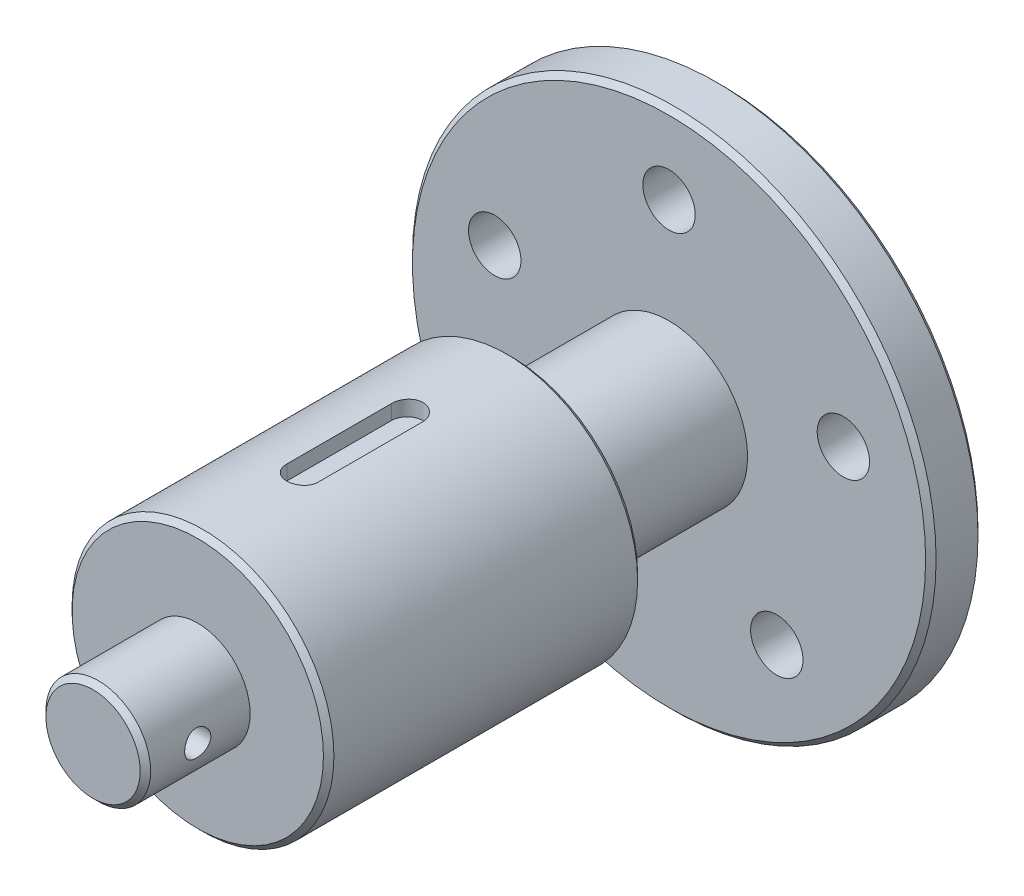
ISO-10303-21;
HEADER;
FILE_DESCRIPTION(('STEP AP214'),'2;1');
FILE_NAME('part.step','',(''),(''),'','','');
FILE_SCHEMA(('AUTOMOTIVE_DESIGN { 1 0 10303 214 1 1 1 1 }'));
ENDSEC;
DATA;
#1=APPLICATION_CONTEXT('core data for automotive mechanical design processes');
#2=APPLICATION_PROTOCOL_DEFINITION('international standard','automotive_design',2000,#1);
#3=PRODUCT_CONTEXT('',#1,'mechanical');
#4=PRODUCT('Part','Part','',(#3));
#5=PRODUCT_RELATED_PRODUCT_CATEGORY('part','',(#4));
#6=PRODUCT_DEFINITION_FORMATION('','',#4);
#7=PRODUCT_DEFINITION_CONTEXT('part definition',#1,'design');
#8=PRODUCT_DEFINITION('design','',#6,#7);
#9=PRODUCT_DEFINITION_SHAPE('','',#8);
#10=(LENGTH_UNIT() NAMED_UNIT(*) SI_UNIT(.MILLI.,.METRE.));
#11=(NAMED_UNIT(*) PLANE_ANGLE_UNIT() SI_UNIT($,.RADIAN.));
#12=(NAMED_UNIT(*) SI_UNIT($,.STERADIAN.) SOLID_ANGLE_UNIT());
#13=UNCERTAINTY_MEASURE_WITH_UNIT(LENGTH_MEASURE(1.E-05),#10,'distance_accuracy_value','');
#14=(GEOMETRIC_REPRESENTATION_CONTEXT(3) GLOBAL_UNCERTAINTY_ASSIGNED_CONTEXT((#13)) GLOBAL_UNIT_ASSIGNED_CONTEXT((#10,
#11,#12)) REPRESENTATION_CONTEXT('',''));
#15=CARTESIAN_POINT('',(0.,0.,0.));
#16=DIRECTION('',(0.,0.,1.));
#17=DIRECTION('',(1.,0.,0.));
#18=AXIS2_PLACEMENT_3D('',#15,#16,#17);
#19=CARTESIAN_POINT('',(0.,0.,0.));
#20=DIRECTION('',(0.,0.,1.));
#21=DIRECTION('',(1.,0.,0.));
#22=AXIS2_PLACEMENT_3D('',#19,#20,#21);
#23=PLANE('',#22);
#24=CARTESIAN_POINT('',(0.,35.,0.));
#25=DIRECTION('',(0.,0.,-1.));
#26=DIRECTION('',(-1.,0.,0.));
#27=AXIS2_PLACEMENT_3D('',#24,#25,#26);
#28=CIRCLE('',#27,4.99999999999999);
#29=CARTESIAN_POINT('',(-4.99999999999999,35.,0.));
#30=VERTEX_POINT('',#29);
#31=EDGE_CURVE('E106',#30,#30,#28,.T.);
#32=ORIENTED_EDGE('',*,*,#31,.F.);
#33=EDGE_LOOP('',(#32));
#34=FACE_BOUND('',#33,.T.);
#35=CARTESIAN_POINT('',(33.28697807033,10.8155948031243,0.));
#36=DIRECTION('',(0.,0.,-1.));
#37=DIRECTION('',(-1.,0.,0.));
#38=AXIS2_PLACEMENT_3D('',#35,#36,#37);
#39=CIRCLE('',#38,4.99999999999999);
#40=CARTESIAN_POINT('',(28.28697807033,10.8155948031243,0.));
#41=VERTEX_POINT('',#40);
#42=EDGE_CURVE('E115',#41,#41,#39,.T.);
#43=ORIENTED_EDGE('',*,*,#42,.F.);
#44=EDGE_LOOP('',(#43));
#45=FACE_BOUND('',#44,.T.);
#46=CARTESIAN_POINT('',(20.5724838302385,-28.3155948031218,0.));
#47=DIRECTION('',(0.,0.,-1.));
#48=DIRECTION('',(-1.,0.,0.));
#49=AXIS2_PLACEMENT_3D('',#46,#47,#48);
#50=CIRCLE('',#49,4.99999999999999);
#51=CARTESIAN_POINT('',(15.5724838302385,-28.3155948031218,0.));
#52=VERTEX_POINT('',#51);
#53=EDGE_CURVE('E121',#52,#52,#50,.T.);
#54=ORIENTED_EDGE('',*,*,#53,.F.);
#55=EDGE_LOOP('',(#54));
#56=FACE_BOUND('',#55,.T.);
#57=CARTESIAN_POINT('',(-20.5724838302337,-28.3155948031252,0.));
#58=DIRECTION('',(0.,0.,-1.));
#59=DIRECTION('',(-1.,0.,0.));
#60=AXIS2_PLACEMENT_3D('',#57,#58,#59);
#61=CIRCLE('',#60,4.99999999999999);
#62=CARTESIAN_POINT('',(-25.5724838302337,-28.3155948031252,0.));
#63=VERTEX_POINT('',#62);
#64=EDGE_CURVE('E127',#63,#63,#61,.T.);
#65=ORIENTED_EDGE('',*,*,#64,.F.);
#66=EDGE_LOOP('',(#65));
#67=FACE_BOUND('',#66,.T.);
#68=CARTESIAN_POINT('',(0.,0.,0.));
#69=DIRECTION('',(0.,0.,1.));
#70=DIRECTION('',(1.,0.,0.));
#71=AXIS2_PLACEMENT_3D('',#68,#69,#70);
#72=CIRCLE('',#71,49.);
#73=CARTESIAN_POINT('',(49.,0.,0.));
#74=VERTEX_POINT('',#73);
#75=EDGE_CURVE('E176',#74,#74,#72,.F.);
#76=ORIENTED_EDGE('',*,*,#75,.T.);
#77=EDGE_LOOP('',(#76));
#78=FACE_BOUND('',#77,.T.);
#79=CARTESIAN_POINT('',(-33.2869780703318,10.8155948031187,0.));
#80=DIRECTION('',(0.,0.,-1.));
#81=DIRECTION('',(-1.,0.,0.));
#82=AXIS2_PLACEMENT_3D('',#79,#80,#81);
#83=CIRCLE('',#82,4.99999999999999);
#84=CARTESIAN_POINT('',(-38.2869780703318,10.8155948031187,0.));
#85=VERTEX_POINT('',#84);
#86=EDGE_CURVE('E133',#85,#85,#83,.T.);
#87=ORIENTED_EDGE('',*,*,#86,.F.);
#88=EDGE_LOOP('',(#87));
#89=FACE_BOUND('',#88,.T.);
#90=ADVANCED_FACE('F33',(#34,#45,#56,#67,#78,#89),#23,.F.);
#91=CARTESIAN_POINT('',(0.,0.,10.));
#92=DIRECTION('',(0.,0.,-1.));
#93=DIRECTION('',(-1.,0.,0.));
#94=AXIS2_PLACEMENT_3D('',#91,#92,#93);
#95=CYLINDRICAL_SURFACE('',#94,50.);
#96=CARTESIAN_POINT('',(0.,0.,8.99999999999994));
#97=DIRECTION('',(0.,0.,1.));
#98=DIRECTION('',(1.,0.,0.));
#99=AXIS2_PLACEMENT_3D('',#96,#97,#98);
#100=CIRCLE('',#99,50.);
#101=CARTESIAN_POINT('',(50.,0.,8.99999999999994));
#102=VERTEX_POINT('',#101);
#103=EDGE_CURVE('E173',#102,#102,#100,.F.);
#104=ORIENTED_EDGE('',*,*,#103,.T.);
#105=EDGE_LOOP('',(#104));
#106=FACE_BOUND('',#105,.T.);
#107=CARTESIAN_POINT('',(0.,0.,1.00000000000001));
#108=DIRECTION('',(0.,0.,1.));
#109=DIRECTION('',(1.,0.,0.));
#110=AXIS2_PLACEMENT_3D('',#107,#108,#109);
#111=CIRCLE('',#110,50.);
#112=CARTESIAN_POINT('',(50.,0.,1.00000000000001));
#113=VERTEX_POINT('',#112);
#114=EDGE_CURVE('E170',#113,#113,#111,.T.);
#115=ORIENTED_EDGE('',*,*,#114,.T.);
#116=EDGE_LOOP('',(#115));
#117=FACE_BOUND('',#116,.T.);
#118=ADVANCED_FACE('F255',(#106,#117),#95,.T.);
#119=CARTESIAN_POINT('',(0.,0.,10.));
#120=DIRECTION('',(0.,0.,1.));
#121=DIRECTION('',(1.,0.,0.));
#122=AXIS2_PLACEMENT_3D('',#119,#120,#121);
#123=PLANE('',#122);
#124=CARTESIAN_POINT('',(0.,35.,10.));
#125=DIRECTION('',(0.,0.,1.));
#126=DIRECTION('',(1.,0.,0.));
#127=AXIS2_PLACEMENT_3D('',#124,#125,#126);
#128=CIRCLE('',#127,4.99999999999999);
#129=CARTESIAN_POINT('',(4.99999999999999,35.,10.));
#130=VERTEX_POINT('',#129);
#131=EDGE_CURVE('E112',#130,#130,#128,.T.);
#132=ORIENTED_EDGE('',*,*,#131,.F.);
#133=EDGE_LOOP('',(#132));
#134=FACE_BOUND('',#133,.T.);
#135=CARTESIAN_POINT('',(33.28697807033,10.8155948031243,10.));
#136=DIRECTION('',(0.,0.,1.));
#137=DIRECTION('',(1.,0.,0.));
#138=AXIS2_PLACEMENT_3D('',#135,#136,#137);
#139=CIRCLE('',#138,4.99999999999999);
#140=CARTESIAN_POINT('',(38.28697807033,10.8155948031243,10.));
#141=VERTEX_POINT('',#140);
#142=EDGE_CURVE('E118',#141,#141,#139,.T.);
#143=ORIENTED_EDGE('',*,*,#142,.F.);
#144=EDGE_LOOP('',(#143));
#145=FACE_BOUND('',#144,.T.);
#146=CARTESIAN_POINT('',(20.5724838302385,-28.3155948031218,10.));
#147=DIRECTION('',(0.,0.,1.));
#148=DIRECTION('',(1.,0.,0.));
#149=AXIS2_PLACEMENT_3D('',#146,#147,#148);
#150=CIRCLE('',#149,4.99999999999999);
#151=CARTESIAN_POINT('',(25.5724838302385,-28.3155948031218,10.));
#152=VERTEX_POINT('',#151);
#153=EDGE_CURVE('E124',#152,#152,#150,.T.);
#154=ORIENTED_EDGE('',*,*,#153,.F.);
#155=EDGE_LOOP('',(#154));
#156=FACE_BOUND('',#155,.T.);
#157=CARTESIAN_POINT('',(-20.5724838302337,-28.3155948031252,10.));
#158=DIRECTION('',(0.,0.,1.));
#159=DIRECTION('',(1.,0.,0.));
#160=AXIS2_PLACEMENT_3D('',#157,#158,#159);
#161=CIRCLE('',#160,4.99999999999999);
#162=CARTESIAN_POINT('',(-15.5724838302337,-28.3155948031252,10.));
#163=VERTEX_POINT('',#162);
#164=EDGE_CURVE('E130',#163,#163,#161,.T.);
#165=ORIENTED_EDGE('',*,*,#164,.F.);
#166=EDGE_LOOP('',(#165));
#167=FACE_BOUND('',#166,.T.);
#168=CARTESIAN_POINT('',(-33.2869780703318,10.8155948031187,10.));
#169=DIRECTION('',(0.,0.,1.));
#170=DIRECTION('',(1.,0.,0.));
#171=AXIS2_PLACEMENT_3D('',#168,#169,#170);
#172=CIRCLE('',#171,4.99999999999999);
#173=CARTESIAN_POINT('',(-28.2869780703318,10.8155948031187,10.));
#174=VERTEX_POINT('',#173);
#175=EDGE_CURVE('E136',#174,#174,#172,.T.);
#176=ORIENTED_EDGE('',*,*,#175,.F.);
#177=EDGE_LOOP('',(#176));
#178=FACE_BOUND('',#177,.T.);
#179=CARTESIAN_POINT('',(0.,0.,10.));
#180=DIRECTION('',(0.,0.,1.));
#181=DIRECTION('',(1.,0.,0.));
#182=AXIS2_PLACEMENT_3D('',#179,#180,#181);
#183=CIRCLE('',#182,48.9999999999999);
#184=CARTESIAN_POINT('',(48.9999999999999,0.,10.));
#185=VERTEX_POINT('',#184);
#186=EDGE_CURVE('E167',#185,#185,#183,.T.);
#187=ORIENTED_EDGE('',*,*,#186,.T.);
#188=EDGE_LOOP('',(#187));
#189=FACE_BOUND('',#188,.T.);
#190=CARTESIAN_POINT('',(0.,0.,10.));
#191=DIRECTION('',(0.,0.,1.));
#192=DIRECTION('',(1.,0.,0.));
#193=AXIS2_PLACEMENT_3D('',#190,#191,#192);
#194=CIRCLE('',#193,15.);
#195=CARTESIAN_POINT('',(15.,0.,10.));
#196=VERTEX_POINT('',#195);
#197=EDGE_CURVE('E146',#196,#196,#194,.T.);
#198=ORIENTED_EDGE('',*,*,#197,.F.);
#199=EDGE_LOOP('',(#198));
#200=FACE_BOUND('',#199,.T.);
#201=ADVANCED_FACE('F261',(#134,#145,#156,#167,#178,#189,#200),#123,.T.);
#202=CARTESIAN_POINT('',(0.,0.,38.));
#203=DIRECTION('',(0.,0.,-1.));
#204=DIRECTION('',(-1.,0.,0.));
#205=AXIS2_PLACEMENT_3D('',#202,#203,#204);
#206=CYLINDRICAL_SURFACE('',#205,15.);
#207=ORIENTED_EDGE('',*,*,#197,.T.);
#208=EDGE_LOOP('',(#207));
#209=FACE_BOUND('',#208,.T.);
#210=CARTESIAN_POINT('',(0.,0.,39.));
#211=DIRECTION('',(0.,0.,1.));
#212=DIRECTION('',(1.,0.,0.));
#213=AXIS2_PLACEMENT_3D('',#210,#211,#212);
#214=CIRCLE('',#213,15.);
#215=CARTESIAN_POINT('',(15.,0.,39.));
#216=VERTEX_POINT('',#215);
#217=EDGE_CURVE('E142',#216,#216,#214,.T.);
#218=ORIENTED_EDGE('',*,*,#217,.F.);
#219=EDGE_LOOP('',(#218));
#220=FACE_BOUND('',#219,.T.);
#221=ADVANCED_FACE('F298',(#209,#220),#206,.T.);
#222=CARTESIAN_POINT('',(0.,0.,40.));
#223=DIRECTION('',(0.,0.,1.));
#224=DIRECTION('',(1.,0.,0.));
#225=AXIS2_PLACEMENT_3D('',#222,#223,#224);
#226=CONICAL_SURFACE('',#225,16.,0.78539816339745);
#227=CARTESIAN_POINT('',(0.,0.,40.));
#228=DIRECTION('',(0.,0.,1.));
#229=DIRECTION('',(1.,0.,0.));
#230=AXIS2_PLACEMENT_3D('',#227,#228,#229);
#231=CIRCLE('',#230,16.);
#232=CARTESIAN_POINT('',(16.,0.,40.));
#233=VERTEX_POINT('',#232);
#234=EDGE_CURVE('E143',#233,#233,#231,.T.);
#235=ORIENTED_EDGE('',*,*,#234,.F.);
#236=EDGE_LOOP('',(#235));
#237=FACE_BOUND('',#236,.T.);
#238=ORIENTED_EDGE('',*,*,#217,.T.);
#239=EDGE_LOOP('',(#238));
#240=FACE_BOUND('',#239,.T.);
#241=ADVANCED_FACE('F35',(#237,#240),#226,.T.);
#242=CARTESIAN_POINT('',(0.,0.,100.));
#243=DIRECTION('',(0.,0.,-1.));
#244=DIRECTION('',(-1.,0.,0.));
#245=AXIS2_PLACEMENT_3D('',#242,#243,#244);
#246=CYLINDRICAL_SURFACE('',#245,25.);
#247=DIRECTION('',(0.,0.,-1.));
#248=VECTOR('',#247,1.);
#249=CARTESIAN_POINT('',(3.,24.8193472919817,100.));
#250=LINE('',#249,#248);
#251=CARTESIAN_POINT('',(3.,24.8193472919817,60.));
#252=VERTEX_POINT('',#251);
#253=CARTESIAN_POINT('',(3.,24.8193472919817,80.));
#254=VERTEX_POINT('',#253);
#255=EDGE_CURVE('E45',#252,#254,#250,.F.);
#256=ORIENTED_EDGE('',*,*,#255,.T.);
#257=CARTESIAN_POINT('',(3.,24.8193472919817,80.));
#258=CARTESIAN_POINT('',(3.00000843700235,24.8193430736193,80.0840545705342));
#259=CARTESIAN_POINT('',(2.99646747025333,24.8197741982077,80.1681048931886));
#260=CARTESIAN_POINT('',(2.98235207723993,24.8214759555701,80.3355982142583));
#261=CARTESIAN_POINT('',(2.97177817640363,24.8227465256294,80.4190412575723));
#262=CARTESIAN_POINT('',(2.94367627524766,24.8260943334576,80.5846512438442));
#263=CARTESIAN_POINT('',(2.92615522582029,24.8281707648871,80.6668193772675));
#264=CARTESIAN_POINT('',(2.88430583660214,24.833067059444,80.8293564953975));
#265=CARTESIAN_POINT('',(2.85997754065988,24.8358869177826,80.9097254916898));
#266=CARTESIAN_POINT('',(2.77699495332482,24.8453506394644,81.1473385626879));
#267=CARTESIAN_POINT('',(2.70832727734934,24.8530006371154,81.3011805834116));
#268=CARTESIAN_POINT('',(2.54636529375022,24.8701147720304,81.5950593886498));
#269=CARTESIAN_POINT('',(2.45307313505292,24.8795787509723,81.7350973763492));
#270=CARTESIAN_POINT('',(2.24397860633709,24.8993093935248,81.9982262561697));
#271=CARTESIAN_POINT('',(2.12807646891959,24.9095794895088,82.1212377475461));
#272=CARTESIAN_POINT('',(1.87725939084289,24.929735159082,82.3461199338231));
#273=CARTESIAN_POINT('',(1.74234155834833,24.9396206738931,82.447987407384));
#274=CARTESIAN_POINT('',(1.45682542703622,24.9579276686417,82.6279687423429));
#275=CARTESIAN_POINT('',(1.30618100217361,24.9663446368759,82.7060099362334));
#276=CARTESIAN_POINT('',(0.993816096927468,24.9807274830984,82.8356516687918));
#277=CARTESIAN_POINT('',(0.832096656054217,24.9866935907597,82.8872546851235));
#278=CARTESIAN_POINT('',(0.502989868574016,24.995478678279,82.9623217642843));
#279=CARTESIAN_POINT('',(0.335633549841869,24.9983126679218,82.9859200722378));
#280=CARTESIAN_POINT('',(-0.000690387403202205,25.0005654502745,83.0047237227123));
#281=CARTESIAN_POINT('',(-0.169657986279599,24.9999842845517,82.9999294108113));
#282=CARTESIAN_POINT('',(-0.503486116101073,24.9954842865412,82.9621908286483));
#283=CARTESIAN_POINT('',(-0.668363323052679,24.9915826671991,82.929391729926));
#284=CARTESIAN_POINT('',(-0.990255211381976,24.9808996061534,82.8368015166855));
#285=CARTESIAN_POINT('',(-1.14726979527835,24.9741181287549,82.7770100676064));
#286=CARTESIAN_POINT('',(-1.44943435784417,24.9584076216555,82.6319757638004));
#287=CARTESIAN_POINT('',(-1.59455350752095,24.9494732343632,82.5466692842213));
#288=CARTESIAN_POINT('',(-1.86846446131942,24.930457665413,82.353076275243));
#289=CARTESIAN_POINT('',(-1.99725627311207,24.9203764842939,82.2447897566404));
#290=CARTESIAN_POINT('',(-2.23569948521557,24.9001221731951,82.0075139289929));
#291=CARTESIAN_POINT('',(-2.34522783687393,24.8899488597477,81.8784009599752));
#292=CARTESIAN_POINT('',(-2.54111038184353,24.8707153122042,81.6035092642862));
#293=CARTESIAN_POINT('',(-2.62745765364829,24.8616554109923,81.4577255784871));
#294=CARTESIAN_POINT('',(-2.77453048342125,24.8456732661311,81.1535048272786));
#295=CARTESIAN_POINT('',(-2.83523138851723,24.8387530810146,80.9950557602794));
#296=CARTESIAN_POINT('',(-2.92904058504843,24.8278671834514,80.6702276497036));
#297=CARTESIAN_POINT('',(-2.96219046692828,24.8238970186796,80.5038609613066));
#298=CARTESIAN_POINT('',(-2.98741264811551,24.8208658563087,80.2802534901679));
#299=CARTESIAN_POINT('',(-2.9921351676027,24.8202967895628,80.2242586935252));
#300=CARTESIAN_POINT('',(-2.9984246127832,24.8195379557837,80.1121838100649));
#301=CARTESIAN_POINT('',(-2.99999682241004,24.8193475536301,80.0561040242145));
#302=CARTESIAN_POINT('',(-3.,24.8193472919817,80.));
#303=B_SPLINE_CURVE_WITH_KNOTS('',3,(#257,#258,#259,#260,#261,#262,#263,#264,#265,#266,#267,
#268,#269,#270,#271,#272,#273,#274,#275,#276,#277,#278,#279,#280,#281,#282,#283,#284,#285,#286,
#287,#288,#289,#290,#291,#292,#293,#294,#295,#296,#297,#298,#299,#300,#301,#302),.UNSPECIFIED.,
.F.,.F.,(4,2,2,2,2,2,2,2,2,2,2,2,2,2,2,2,2,2,2,2,2,2,4),(0.,0.252080487248506,0.504142143765632,
0.755952236629464,1.00776070750916,1.51110152671864,2.01439843495776,2.51996855511054,
3.02561564359015,3.53278983870557,4.03991649509848,4.54460220919589,5.04928178057385,
5.55136096184882,6.0534463663943,6.55679437122678,7.0601421395737,7.56659676194981,
8.07320243596131,8.5802939887554,9.08661864921346,9.25514284244893,9.42338413699563),.UNSPECIFIED.);
#304=CARTESIAN_POINT('',(-3.,24.8193472919817,80.));
#305=VERTEX_POINT('',#304);
#306=EDGE_CURVE('E179',#254,#305,#303,.T.);
#307=ORIENTED_EDGE('',*,*,#306,.T.);
#308=DIRECTION('',(0.,0.,-1.));
#309=VECTOR('',#308,1.);
#310=CARTESIAN_POINT('',(-3.,24.8193472919817,100.));
#311=LINE('',#310,#309);
#312=CARTESIAN_POINT('',(-3.,24.8193472919817,60.));
#313=VERTEX_POINT('',#312);
#314=EDGE_CURVE('E479',#305,#313,#311,.T.);
#315=ORIENTED_EDGE('',*,*,#314,.T.);
#316=CARTESIAN_POINT('',(-3.,24.8193472919817,60.));
#317=CARTESIAN_POINT('',(-3.00000843700235,24.8193430736193,59.9159454294658));
#318=CARTESIAN_POINT('',(-2.99646747025333,24.8197741982077,59.8318951068114));
#319=CARTESIAN_POINT('',(-2.98235207723993,24.8214759555701,59.6644017857418));
#320=CARTESIAN_POINT('',(-2.97177817640363,24.8227465256294,59.5809587424277));
#321=CARTESIAN_POINT('',(-2.94367627524767,24.8260943334576,59.4153487561558));
#322=CARTESIAN_POINT('',(-2.92615522582029,24.8281707648871,59.3331806227325));
#323=CARTESIAN_POINT('',(-2.88430583660214,24.833067059444,59.1706435046025));
#324=CARTESIAN_POINT('',(-2.85997754065988,24.8358869177826,59.0902745083102));
#325=CARTESIAN_POINT('',(-2.77699495332482,24.8453506394644,58.8526614373121));
#326=CARTESIAN_POINT('',(-2.70832727734934,24.8530006371154,58.6988194165884));
#327=CARTESIAN_POINT('',(-2.54636529375022,24.8701147720304,58.4049406113502));
#328=CARTESIAN_POINT('',(-2.45307313505291,24.8795787509723,58.2649026236509));
#329=CARTESIAN_POINT('',(-2.24397860633709,24.8993093935248,58.0017737438303));
#330=CARTESIAN_POINT('',(-2.12807646891959,24.9095794895088,57.8787622524539));
#331=CARTESIAN_POINT('',(-1.87725939084289,24.929735159082,57.6538800661769));
#332=CARTESIAN_POINT('',(-1.74234155834833,24.9396206738931,57.552012592616));
#333=CARTESIAN_POINT('',(-1.45682542703621,24.9579276686417,57.3720312576571));
#334=CARTESIAN_POINT('',(-1.30618100217361,24.9663446368759,57.2939900637666));
#335=CARTESIAN_POINT('',(-0.99381609692747,24.9807274830984,57.1643483312083));
#336=CARTESIAN_POINT('',(-0.832096656054217,24.9866935907597,57.1127453148765));
#337=CARTESIAN_POINT('',(-0.502989868574015,24.995478678279,57.0376782357158));
#338=CARTESIAN_POINT('',(-0.335633549841869,24.9983126679218,57.0140799277623));
#339=CARTESIAN_POINT('',(0.000690387403201825,25.0005654502745,56.9952762772877));
#340=CARTESIAN_POINT('',(0.169657986279598,24.9999842845517,57.0000705891887));
#341=CARTESIAN_POINT('',(0.503486116101072,24.9954842865412,57.0378091713518));
#342=CARTESIAN_POINT('',(0.668363323052679,24.9915826671991,57.070608270074));
#343=CARTESIAN_POINT('',(0.990255211381976,24.9808996061534,57.1631984833145));
#344=CARTESIAN_POINT('',(1.14726979527834,24.9741181287549,57.2229899323936));
#345=CARTESIAN_POINT('',(1.44943435784416,24.9584076216555,57.3680242361996));
#346=CARTESIAN_POINT('',(1.59455350752095,24.9494732343632,57.4533307157787));
#347=CARTESIAN_POINT('',(1.86846446131942,24.930457665413,57.646923724757));
#348=CARTESIAN_POINT('',(1.99725627311207,24.9203764842939,57.7552102433596));
#349=CARTESIAN_POINT('',(2.23569948521557,24.9001221731951,57.9924860710071));
#350=CARTESIAN_POINT('',(2.34522783687393,24.8899488597477,58.1215990400248));
#351=CARTESIAN_POINT('',(2.54111038184352,24.8707153122042,58.3964907357138));
#352=CARTESIAN_POINT('',(2.62745765364829,24.8616554109923,58.5422744215129));
#353=CARTESIAN_POINT('',(2.77453048342125,24.8456732661311,58.8464951727214));
#354=CARTESIAN_POINT('',(2.83523138851723,24.8387530810146,59.0049442397206));
#355=CARTESIAN_POINT('',(2.92904058504843,24.8278671834514,59.3297723502964));
#356=CARTESIAN_POINT('',(2.96219046692828,24.8238970186796,59.4961390386934));
#357=CARTESIAN_POINT('',(2.98741264811551,24.8208658563087,59.7197465098321));
#358=CARTESIAN_POINT('',(2.99213516760269,24.8202967895628,59.7757413064748));
#359=CARTESIAN_POINT('',(2.99842461278319,24.8195379557837,59.8878161899351));
#360=CARTESIAN_POINT('',(2.99999682241004,24.8193475536301,59.9438959757855));
#361=CARTESIAN_POINT('',(3.,24.8193472919817,60.));
#362=B_SPLINE_CURVE_WITH_KNOTS('',3,(#316,#317,#318,#319,#320,#321,#322,#323,#324,#325,#326,
#327,#328,#329,#330,#331,#332,#333,#334,#335,#336,#337,#338,#339,#340,#341,#342,#343,#344,#345,
#346,#347,#348,#349,#350,#351,#352,#353,#354,#355,#356,#357,#358,#359,#360,#361),.UNSPECIFIED.,
.F.,.F.,(4,2,2,2,2,2,2,2,2,2,2,2,2,2,2,2,2,2,2,2,2,2,4),(0.,0.252080487248506,0.504142143765639,
0.755952236629471,1.00776070750916,1.51110152671864,2.01439843495776,2.51996855511055,
3.02561564359015,3.53278983870558,4.03991649509848,4.54460220919589,5.04928178057385,
5.55136096184882,6.05344636639431,6.55679437122678,7.0601421395737,7.56659676194982,
8.07320243596131,8.5802939887554,9.08661864921346,9.25514284244891,9.42338413699562),.UNSPECIFIED.);
#363=EDGE_CURVE('E52',#313,#252,#362,.T.);
#364=ORIENTED_EDGE('',*,*,#363,.T.);
#365=EDGE_LOOP('',(#256,#307,#315,#364));
#366=FACE_BOUND('',#365,.T.);
#367=CARTESIAN_POINT('',(0.,0.,99.));
#368=DIRECTION('',(0.,0.,1.));
#369=DIRECTION('',(1.,0.,0.));
#370=AXIS2_PLACEMENT_3D('',#367,#368,#369);
#371=CIRCLE('',#370,25.);
#372=CARTESIAN_POINT('',(25.,0.,99.));
#373=VERTEX_POINT('',#372);
#374=EDGE_CURVE('E161',#373,#373,#371,.F.);
#375=ORIENTED_EDGE('',*,*,#374,.T.);
#376=EDGE_LOOP('',(#375));
#377=FACE_BOUND('',#376,.T.);
#378=CARTESIAN_POINT('',(0.,0.,41.));
#379=DIRECTION('',(0.,0.,1.));
#380=DIRECTION('',(1.,0.,0.));
#381=AXIS2_PLACEMENT_3D('',#378,#379,#380);
#382=CIRCLE('',#381,25.);
#383=CARTESIAN_POINT('',(25.,0.,41.));
#384=VERTEX_POINT('',#383);
#385=EDGE_CURVE('E158',#384,#384,#382,.T.);
#386=ORIENTED_EDGE('',*,*,#385,.T.);
#387=EDGE_LOOP('',(#386));
#388=FACE_BOUND('',#387,.T.);
#389=ADVANCED_FACE('F194',(#366,#377,#388),#246,.T.);
#390=CARTESIAN_POINT('',(0.,0.,100.));
#391=DIRECTION('',(0.,0.,1.));
#392=DIRECTION('',(1.,0.,0.));
#393=AXIS2_PLACEMENT_3D('',#390,#391,#392);
#394=PLANE('',#393);
#395=CARTESIAN_POINT('',(0.,0.,100.));
#396=DIRECTION('',(0.,0.,1.));
#397=DIRECTION('',(1.,0.,0.));
#398=AXIS2_PLACEMENT_3D('',#395,#396,#397);
#399=CIRCLE('',#398,24.);
#400=CARTESIAN_POINT('',(24.,0.,100.));
#401=VERTEX_POINT('',#400);
#402=EDGE_CURVE('E155',#401,#401,#399,.T.);
#403=ORIENTED_EDGE('',*,*,#402,.T.);
#404=EDGE_LOOP('',(#403));
#405=FACE_BOUND('',#404,.T.);
#406=CARTESIAN_POINT('',(0.,0.,100.));
#407=DIRECTION('',(0.,0.,1.));
#408=DIRECTION('',(1.,0.,0.));
#409=AXIS2_PLACEMENT_3D('',#406,#407,#408);
#410=CIRCLE('',#409,10.);
#411=CARTESIAN_POINT('',(10.,0.,100.));
#412=VERTEX_POINT('',#411);
#413=EDGE_CURVE('E139',#412,#412,#410,.T.);
#414=ORIENTED_EDGE('',*,*,#413,.F.);
#415=EDGE_LOOP('',(#414));
#416=FACE_BOUND('',#415,.T.);
#417=ADVANCED_FACE('F241',(#405,#416),#394,.T.);
#418=CARTESIAN_POINT('',(0.,0.,40.));
#419=DIRECTION('',(0.,0.,1.));
#420=DIRECTION('',(1.,0.,0.));
#421=AXIS2_PLACEMENT_3D('',#418,#419,#420);
#422=PLANE('',#421);
#423=CARTESIAN_POINT('',(0.,0.,40.));
#424=DIRECTION('',(0.,0.,1.));
#425=DIRECTION('',(1.,0.,0.));
#426=AXIS2_PLACEMENT_3D('',#423,#424,#425);
#427=CIRCLE('',#426,24.);
#428=CARTESIAN_POINT('',(24.,0.,40.));
#429=VERTEX_POINT('',#428);
#430=EDGE_CURVE('E164',#429,#429,#427,.F.);
#431=ORIENTED_EDGE('',*,*,#430,.T.);
#432=EDGE_LOOP('',(#431));
#433=FACE_BOUND('',#432,.T.);
#434=ORIENTED_EDGE('',*,*,#234,.T.);
#435=EDGE_LOOP('',(#434));
#436=FACE_BOUND('',#435,.T.);
#437=ADVANCED_FACE('F239',(#433,#436),#422,.F.);
#438=CARTESIAN_POINT('',(0.,0.,120.));
#439=DIRECTION('',(0.,0.,-1.));
#440=DIRECTION('',(-1.,0.,0.));
#441=AXIS2_PLACEMENT_3D('',#438,#439,#440);
#442=CYLINDRICAL_SURFACE('',#441,10.);
#443=CARTESIAN_POINT('',(-10.,0.,112.5));
#444=CARTESIAN_POINT('',(-9.99999766446687,-0.138126814449551,112.49999612377));
#445=CARTESIAN_POINT('',(-9.99710963553044,-0.276296929717937,112.488514082044));
#446=CARTESIAN_POINT('',(-9.98586856383157,-0.54867720628422,112.442958081155));
#447=CARTESIAN_POINT('',(-9.97751242366627,-0.682885078117898,112.408871317437));
#448=CARTESIAN_POINT('',(-9.9562604388672,-0.943368120304293,112.319267910897));
#449=CARTESIAN_POINT('',(-9.94337004736764,-1.06965260571667,112.263777002141));
#450=CARTESIAN_POINT('',(-9.91442239679369,-1.31112021984071,112.133031016592));
#451=CARTESIAN_POINT('',(-9.89836503090261,-1.4263029739146,112.057775273135));
#452=CARTESIAN_POINT('',(-9.86445689319489,-1.64466987883485,111.88799868391));
#453=CARTESIAN_POINT('',(-9.84657845246877,-1.74759281676842,111.793147375068));
#454=CARTESIAN_POINT('',(-9.8112270019656,-1.93624821200553,111.587579658485));
#455=CARTESIAN_POINT('',(-9.79375403816446,-2.02197872824865,111.476861461755));
#456=CARTESIAN_POINT('',(-9.76091292830281,-2.17504423799829,111.240674622105));
#457=CARTESIAN_POINT('',(-9.74557990774685,-2.24208702654189,111.115011281985));
#458=CARTESIAN_POINT('',(-9.71915824696694,-2.35399484758457,110.853752647233));
#459=CARTESIAN_POINT('',(-9.70806892824031,-2.39886342573356,110.718158944447));
#460=CARTESIAN_POINT('',(-9.69167461160538,-2.46425806134127,110.443760836331));
#461=CARTESIAN_POINT('',(-9.68625818328352,-2.48525378055342,110.30507517327));
#462=CARTESIAN_POINT('',(-9.68148937432653,-2.50376962511067,110.026052385001));
#463=CARTESIAN_POINT('',(-9.68213600713214,-2.50129356969685,109.88571553218));
#464=CARTESIAN_POINT('',(-9.68932009194695,-2.47331087439951,109.610973653758));
#465=CARTESIAN_POINT('',(-9.69571438345489,-2.44836390031772,109.476507297558));
#466=CARTESIAN_POINT('',(-9.71344516118448,-2.37704031150499,109.213731581815));
#467=CARTESIAN_POINT('',(-9.72478199948731,-2.33066217011565,109.085422661618));
#468=CARTESIAN_POINT('',(-9.75125189842765,-2.21731579656196,108.837103306246));
#469=CARTESIAN_POINT('',(-9.76642212449694,-2.15014444538819,108.717189713684));
#470=CARTESIAN_POINT('',(-9.79882851409985,-1.99726046002491,108.490135483739));
#471=CARTESIAN_POINT('',(-9.81606503891047,-1.91154458134806,108.382997086555));
#472=CARTESIAN_POINT('',(-9.85126467566486,-1.72110570780204,108.181327307176));
#473=CARTESIAN_POINT('',(-9.86923449130002,-1.61591043027643,108.087242516564));
#474=CARTESIAN_POINT('',(-9.90343275964594,-1.39101986250616,107.917964595894));
#475=CARTESIAN_POINT('',(-9.91966115915679,-1.27132412951324,107.842772042894));
#476=CARTESIAN_POINT('',(-9.94862886823651,-1.02019314780232,107.713249022959));
#477=CARTESIAN_POINT('',(-9.96135600212879,-0.888718988681035,107.658991099576));
#478=CARTESIAN_POINT('',(-9.98179861652361,-0.618126680238134,107.573471157151));
#479=CARTESIAN_POINT('',(-9.98951505565468,-0.479009998584138,107.542204739303));
#480=CARTESIAN_POINT('',(-9.99892498785624,-0.200899950650043,107.504237390735));
#481=CARTESIAN_POINT('',(-10.0007675584713,-0.061994533313682,107.496928289875));
#482=CARTESIAN_POINT('',(-9.99864674690754,0.215054791335848,107.505415003426));
#483=CARTESIAN_POINT('',(-9.99468388736421,0.353198766074327,107.521208737999));
#484=CARTESIAN_POINT('',(-9.98149301878918,0.622690447960817,107.574951513986));
#485=CARTESIAN_POINT('',(-9.97234390309647,0.754108531614583,107.612568772462));
#486=CARTESIAN_POINT('',(-9.94981177723595,1.00876215408753,107.708511806714));
#487=CARTESIAN_POINT('',(-9.93642833949965,1.13199686505442,107.766839673855));
#488=CARTESIAN_POINT('',(-9.9065551321037,1.36920522404971,107.903726881458));
#489=CARTESIAN_POINT('',(-9.89001445611,1.48297573639294,107.982626853994));
#490=CARTESIAN_POINT('',(-9.85574181979587,1.69587768940551,108.157983181329));
#491=CARTESIAN_POINT('',(-9.83800965421578,1.79500659828874,108.254442566029));
#492=CARTESIAN_POINT('',(-9.80281594932498,1.97831761345413,108.465003268073));
#493=CARTESIAN_POINT('',(-9.78537173637463,2.06207311270184,108.579479504999));
#494=CARTESIAN_POINT('',(-9.75321463970069,2.20918459835604,108.821221057448));
#495=CARTESIAN_POINT('',(-9.73850163474941,2.272541490269,108.948485804951));
#496=CARTESIAN_POINT('',(-9.71363491194665,2.37658570101223,109.211509537344));
#497=CARTESIAN_POINT('',(-9.70345425375809,2.4174073277393,109.347212713854));
#498=CARTESIAN_POINT('',(-9.68877906706586,2.47557609990489,109.623849396425));
#499=CARTESIAN_POINT('',(-9.68428329504045,2.49292837912652,109.764781751702));
#500=CARTESIAN_POINT('',(-9.68158168701612,2.50339765056082,110.043535039769));
#501=CARTESIAN_POINT('',(-9.68319887888035,2.49719649630131,110.181329058544));
#502=CARTESIAN_POINT('',(-9.69213181672143,2.46229546385365,110.453839814444));
#503=CARTESIAN_POINT('',(-9.69944744817732,2.43359603781098,110.588556613355));
#504=CARTESIAN_POINT('',(-9.71885434473222,2.35488553240495,110.850347431776));
#505=CARTESIAN_POINT('',(-9.73091692061057,2.30500234113403,110.977462175401));
#506=CARTESIAN_POINT('',(-9.7584625954084,2.18544152267503,111.221608971189));
#507=CARTESIAN_POINT('',(-9.77394616867808,2.11576115005696,111.338639621978));
#508=CARTESIAN_POINT('',(-9.80709390439337,1.95644624772858,111.562591048337));
#509=CARTESIAN_POINT('',(-9.82480441386302,1.86633860485376,111.669168455707));
#510=CARTESIAN_POINT('',(-9.86013378743769,1.66964895198289,111.865911741326));
#511=CARTESIAN_POINT('',(-9.87775262878422,1.56306303543524,111.956073716855));
#512=CARTESIAN_POINT('',(-9.91129426079449,1.33411264450432,112.119018847608));
#513=CARTESIAN_POINT('',(-9.92718055609783,1.21149737052731,112.191457689453));
#514=CARTESIAN_POINT('',(-9.95508208291861,0.955443432517456,112.314579104901));
#515=CARTESIAN_POINT('',(-9.96710008666301,0.822012605727895,112.365277267748));
#516=CARTESIAN_POINT('',(-9.98413432609236,0.574017088739116,112.435953050549));
#517=CARTESIAN_POINT('',(-9.99004308421151,0.460633618180112,112.459918738422));
#518=CARTESIAN_POINT('',(-9.9979767538658,0.231510119227138,112.49194323937));
#519=CARTESIAN_POINT('',(-10.0000019575149,0.115770268737693,112.500003248842));
#520=CARTESIAN_POINT('',(-10.,0.,112.5));
#521=B_SPLINE_CURVE_WITH_KNOTS('',3,(#443,#444,#445,#446,#447,#448,#449,#450,#451,#452,#453,
#454,#455,#456,#457,#458,#459,#460,#461,#462,#463,#464,#465,#466,#467,#468,#469,#470,#471,#472,
#473,#474,#475,#476,#477,#478,#479,#480,#481,#482,#483,#484,#485,#486,#487,#488,#489,#490,#491,
#492,#493,#494,#495,#496,#497,#498,#499,#500,#501,#502,#503,#504,#505,#506,#507,#508,#509,#510,
#511,#512,#513,#514,#515,#516,#517,#518,#519,#520),.UNSPECIFIED.,.T.,.F.,(4,2,2,2,2,2,2,2,2,2,2,
2,2,2,2,2,2,2,2,2,2,2,2,2,2,2,2,2,2,2,2,2,2,2,2,2,2,2,4),(0.,0.413956187453148,0.82814706293983,
1.24184150381017,1.65554990028221,2.07690725728564,2.4983121596677,2.92597745909678,
3.35357435282279,3.77260491835114,4.1915673019336,4.60037495017228,5.00921172448932,
5.42217546461999,5.83521151399137,6.26002501620565,6.68485149269278,7.11113715020723,
7.53734122819937,7.95263848254326,8.36789835193437,8.77700457528928,9.1861521220935,
9.60255979281119,10.0190393835223,10.4457418201299,10.8724253125471,11.2965375769763,
11.7205570543047,12.1323963400748,12.5442273493652,12.9536066760887,13.3630428023796,
13.7831596069298,14.2033761629382,14.6312030917577,15.0587227304538,15.4057040491337,
15.7526592674819),.UNSPECIFIED.);
#522=CARTESIAN_POINT('',(-10.,0.,112.5));
#523=VERTEX_POINT('',#522);
#524=EDGE_CURVE('E11',#523,#523,#521,.T.);
#525=ORIENTED_EDGE('',*,*,#524,.T.);
#526=EDGE_LOOP('',(#525));
#527=FACE_BOUND('',#526,.T.);
#528=CARTESIAN_POINT('',(10.,0.,112.5));
#529=CARTESIAN_POINT('',(9.99999766446687,0.138126814449551,112.49999612377));
#530=CARTESIAN_POINT('',(9.99710963553044,0.276296929717937,112.488514082044));
#531=CARTESIAN_POINT('',(9.98586856383157,0.54867720628422,112.442958081155));
#532=CARTESIAN_POINT('',(9.97751242366627,0.682885078117898,112.408871317437));
#533=CARTESIAN_POINT('',(9.9562604388672,0.943368120304293,112.319267910897));
#534=CARTESIAN_POINT('',(9.94337004736764,1.06965260571667,112.263777002141));
#535=CARTESIAN_POINT('',(9.91442239679369,1.31112021984071,112.133031016592));
#536=CARTESIAN_POINT('',(9.89836503090261,1.4263029739146,112.057775273135));
#537=CARTESIAN_POINT('',(9.86445689319489,1.64466987883485,111.88799868391));
#538=CARTESIAN_POINT('',(9.84657845246877,1.74759281676842,111.793147375068));
#539=CARTESIAN_POINT('',(9.8112270019656,1.93624821200553,111.587579658485));
#540=CARTESIAN_POINT('',(9.79375403816446,2.02197872824865,111.476861461755));
#541=CARTESIAN_POINT('',(9.76091292830281,2.17504423799829,111.240674622105));
#542=CARTESIAN_POINT('',(9.74557990774685,2.24208702654189,111.115011281985));
#543=CARTESIAN_POINT('',(9.71915824696694,2.35399484758457,110.853752647233));
#544=CARTESIAN_POINT('',(9.70806892824031,2.39886342573356,110.718158944447));
#545=CARTESIAN_POINT('',(9.69167461160538,2.46425806134127,110.443760836331));
#546=CARTESIAN_POINT('',(9.68625818328352,2.48525378055342,110.30507517327));
#547=CARTESIAN_POINT('',(9.68148937432653,2.50376962511067,110.026052385001));
#548=CARTESIAN_POINT('',(9.68213600713214,2.50129356969685,109.88571553218));
#549=CARTESIAN_POINT('',(9.68932009194695,2.47331087439951,109.610973653758));
#550=CARTESIAN_POINT('',(9.69571438345489,2.44836390031772,109.476507297558));
#551=CARTESIAN_POINT('',(9.71344516118448,2.37704031150499,109.213731581815));
#552=CARTESIAN_POINT('',(9.72478199948731,2.33066217011565,109.085422661618));
#553=CARTESIAN_POINT('',(9.75125189842765,2.21731579656196,108.837103306246));
#554=CARTESIAN_POINT('',(9.76642212449694,2.15014444538819,108.717189713684));
#555=CARTESIAN_POINT('',(9.79882851409985,1.99726046002491,108.490135483739));
#556=CARTESIAN_POINT('',(9.81606503891047,1.91154458134806,108.382997086555));
#557=CARTESIAN_POINT('',(9.85126467566486,1.72110570780204,108.181327307176));
#558=CARTESIAN_POINT('',(9.86923449130002,1.61591043027643,108.087242516564));
#559=CARTESIAN_POINT('',(9.90343275964594,1.39101986250616,107.917964595894));
#560=CARTESIAN_POINT('',(9.91966115915679,1.27132412951324,107.842772042894));
#561=CARTESIAN_POINT('',(9.94862886823651,1.02019314780232,107.713249022959));
#562=CARTESIAN_POINT('',(9.96135600212879,0.888718988681035,107.658991099576));
#563=CARTESIAN_POINT('',(9.98179861652361,0.618126680238134,107.573471157151));
#564=CARTESIAN_POINT('',(9.98951505565468,0.479009998584138,107.542204739303));
#565=CARTESIAN_POINT('',(9.99892498785624,0.200899950650043,107.504237390735));
#566=CARTESIAN_POINT('',(10.0007675584713,0.061994533313682,107.496928289875));
#567=CARTESIAN_POINT('',(9.99864674690754,-0.215054791335848,107.505415003426));
#568=CARTESIAN_POINT('',(9.99468388736421,-0.353198766074327,107.521208737999));
#569=CARTESIAN_POINT('',(9.98149301878918,-0.622690447960817,107.574951513986));
#570=CARTESIAN_POINT('',(9.97234390309647,-0.754108531614583,107.612568772462));
#571=CARTESIAN_POINT('',(9.94981177723595,-1.00876215408753,107.708511806714));
#572=CARTESIAN_POINT('',(9.93642833949965,-1.13199686505442,107.766839673855));
#573=CARTESIAN_POINT('',(9.9065551321037,-1.36920522404971,107.903726881458));
#574=CARTESIAN_POINT('',(9.89001445611,-1.48297573639294,107.982626853994));
#575=CARTESIAN_POINT('',(9.85574181979587,-1.69587768940551,108.157983181329));
#576=CARTESIAN_POINT('',(9.83800965421578,-1.79500659828874,108.254442566029));
#577=CARTESIAN_POINT('',(9.80281594932498,-1.97831761345413,108.465003268073));
#578=CARTESIAN_POINT('',(9.78537173637463,-2.06207311270184,108.579479504999));
#579=CARTESIAN_POINT('',(9.75321463970069,-2.20918459835604,108.821221057448));
#580=CARTESIAN_POINT('',(9.73850163474941,-2.272541490269,108.948485804951));
#581=CARTESIAN_POINT('',(9.71363491194665,-2.37658570101223,109.211509537344));
#582=CARTESIAN_POINT('',(9.70345425375809,-2.4174073277393,109.347212713854));
#583=CARTESIAN_POINT('',(9.68877906706586,-2.47557609990489,109.623849396425));
#584=CARTESIAN_POINT('',(9.68428329504045,-2.49292837912652,109.764781751702));
#585=CARTESIAN_POINT('',(9.68158168701612,-2.50339765056082,110.043535039769));
#586=CARTESIAN_POINT('',(9.68319887888035,-2.49719649630131,110.181329058544));
#587=CARTESIAN_POINT('',(9.69213181672143,-2.46229546385365,110.453839814444));
#588=CARTESIAN_POINT('',(9.69944744817732,-2.43359603781098,110.588556613355));
#589=CARTESIAN_POINT('',(9.71885434473222,-2.35488553240495,110.850347431776));
#590=CARTESIAN_POINT('',(9.73091692061057,-2.30500234113403,110.977462175401));
#591=CARTESIAN_POINT('',(9.7584625954084,-2.18544152267503,111.221608971189));
#592=CARTESIAN_POINT('',(9.77394616867808,-2.11576115005696,111.338639621978));
#593=CARTESIAN_POINT('',(9.80709390439337,-1.95644624772858,111.562591048337));
#594=CARTESIAN_POINT('',(9.82480441386302,-1.86633860485376,111.669168455707));
#595=CARTESIAN_POINT('',(9.86013378743769,-1.66964895198289,111.865911741326));
#596=CARTESIAN_POINT('',(9.87775262878422,-1.56306303543524,111.956073716855));
#597=CARTESIAN_POINT('',(9.91129426079449,-1.33411264450432,112.119018847608));
#598=CARTESIAN_POINT('',(9.92718055609783,-1.21149737052731,112.191457689453));
#599=CARTESIAN_POINT('',(9.95508208291861,-0.955443432517456,112.314579104901));
#600=CARTESIAN_POINT('',(9.96710008666301,-0.822012605727895,112.365277267748));
#601=CARTESIAN_POINT('',(9.98413432609236,-0.574017088739116,112.435953050549));
#602=CARTESIAN_POINT('',(9.99004308421151,-0.460633618180112,112.459918738422));
#603=CARTESIAN_POINT('',(9.9979767538658,-0.231510119227138,112.49194323937));
#604=CARTESIAN_POINT('',(10.0000019575149,-0.115770268737693,112.500003248842));
#605=CARTESIAN_POINT('',(10.,0.,112.5));
#606=B_SPLINE_CURVE_WITH_KNOTS('',3,(#528,#529,#530,#531,#532,#533,#534,#535,#536,#537,#538,
#539,#540,#541,#542,#543,#544,#545,#546,#547,#548,#549,#550,#551,#552,#553,#554,#555,#556,#557,
#558,#559,#560,#561,#562,#563,#564,#565,#566,#567,#568,#569,#570,#571,#572,#573,#574,#575,#576,
#577,#578,#579,#580,#581,#582,#583,#584,#585,#586,#587,#588,#589,#590,#591,#592,#593,#594,#595,
#596,#597,#598,#599,#600,#601,#602,#603,#604,#605),.UNSPECIFIED.,.T.,.F.,(4,2,2,2,2,2,2,2,2,2,2,
2,2,2,2,2,2,2,2,2,2,2,2,2,2,2,2,2,2,2,2,2,2,2,2,2,2,2,4),(0.,0.413956187453148,0.82814706293983,
1.24184150381017,1.65554990028221,2.07690725728564,2.4983121596677,2.92597745909678,
3.35357435282279,3.77260491835114,4.1915673019336,4.60037495017228,5.00921172448932,
5.42217546461999,5.83521151399137,6.26002501620565,6.68485149269278,7.11113715020723,
7.53734122819937,7.95263848254326,8.36789835193437,8.77700457528928,9.1861521220935,
9.60255979281119,10.0190393835223,10.4457418201299,10.8724253125471,11.2965375769763,
11.7205570543047,12.1323963400748,12.5442273493652,12.9536066760887,13.3630428023796,
13.7831596069298,14.2033761629382,14.6312030917577,15.0587227304538,15.4057040491337,
15.7526592674819),.UNSPECIFIED.);
#607=CARTESIAN_POINT('',(10.,0.,112.5));
#608=VERTEX_POINT('',#607);
#609=EDGE_CURVE('E98',#608,#608,#606,.T.);
#610=ORIENTED_EDGE('',*,*,#609,.T.);
#611=EDGE_LOOP('',(#610));
#612=FACE_BOUND('',#611,.T.);
#613=CARTESIAN_POINT('',(0.,0.,119.));
#614=DIRECTION('',(0.,0.,1.));
#615=DIRECTION('',(1.,0.,0.));
#616=AXIS2_PLACEMENT_3D('',#613,#614,#615);
#617=CIRCLE('',#616,10.);
#618=CARTESIAN_POINT('',(10.,0.,119.));
#619=VERTEX_POINT('',#618);
#620=EDGE_CURVE('E152',#619,#619,#617,.F.);
#621=ORIENTED_EDGE('',*,*,#620,.T.);
#622=EDGE_LOOP('',(#621));
#623=FACE_BOUND('',#622,.T.);
#624=ORIENTED_EDGE('',*,*,#413,.T.);
#625=EDGE_LOOP('',(#624));
#626=FACE_BOUND('',#625,.T.);
#627=ADVANCED_FACE('F234',(#527,#612,#623,#626),#442,.T.);
#628=CARTESIAN_POINT('',(0.,0.,120.));
#629=DIRECTION('',(0.,0.,1.));
#630=DIRECTION('',(1.,0.,0.));
#631=AXIS2_PLACEMENT_3D('',#628,#629,#630);
#632=PLANE('',#631);
#633=CARTESIAN_POINT('',(0.,0.,120.));
#634=DIRECTION('',(0.,0.,1.));
#635=DIRECTION('',(1.,0.,0.));
#636=AXIS2_PLACEMENT_3D('',#633,#634,#635);
#637=CIRCLE('',#636,9.00000000000001);
#638=CARTESIAN_POINT('',(9.00000000000001,0.,120.));
#639=VERTEX_POINT('',#638);
#640=EDGE_CURVE('E149',#639,#639,#637,.T.);
#641=ORIENTED_EDGE('',*,*,#640,.T.);
#642=EDGE_LOOP('',(#641));
#643=FACE_BOUND('',#642,.T.);
#644=ADVANCED_FACE('F231',(#643),#632,.T.);
#645=CARTESIAN_POINT('',(0.,0.,120.));
#646=DIRECTION('',(0.,0.,-1.));
#647=DIRECTION('',(-1.,0.,0.));
#648=AXIS2_PLACEMENT_3D('',#645,#646,#647);
#649=CONICAL_SURFACE('',#648,9.00000000000001,0.785398163397451);
#650=ORIENTED_EDGE('',*,*,#620,.F.);
#651=EDGE_LOOP('',(#650));
#652=FACE_BOUND('',#651,.T.);
#653=ORIENTED_EDGE('',*,*,#640,.F.);
#654=EDGE_LOOP('',(#653));
#655=FACE_BOUND('',#654,.T.);
#656=ADVANCED_FACE('F233',(#652,#655),#649,.T.);
#657=CARTESIAN_POINT('',(0.,0.,100.));
#658=DIRECTION('',(0.,0.,-1.));
#659=DIRECTION('',(-1.,0.,0.));
#660=AXIS2_PLACEMENT_3D('',#657,#658,#659);
#661=CONICAL_SURFACE('',#660,24.,0.785398163397431);
#662=ORIENTED_EDGE('',*,*,#374,.F.);
#663=EDGE_LOOP('',(#662));
#664=FACE_BOUND('',#663,.T.);
#665=ORIENTED_EDGE('',*,*,#402,.F.);
#666=EDGE_LOOP('',(#665));
#667=FACE_BOUND('',#666,.T.);
#668=ADVANCED_FACE('F270',(#664,#667),#661,.T.);
#669=CARTESIAN_POINT('',(0.,0.,41.));
#670=DIRECTION('',(0.,0.,1.));
#671=DIRECTION('',(1.,0.,0.));
#672=AXIS2_PLACEMENT_3D('',#669,#670,#671);
#673=CONICAL_SURFACE('',#672,25.,0.785398163397454);
#674=ORIENTED_EDGE('',*,*,#430,.F.);
#675=EDGE_LOOP('',(#674));
#676=FACE_BOUND('',#675,.T.);
#677=ORIENTED_EDGE('',*,*,#385,.F.);
#678=EDGE_LOOP('',(#677));
#679=FACE_BOUND('',#678,.T.);
#680=ADVANCED_FACE('F274',(#676,#679),#673,.T.);
#681=CARTESIAN_POINT('',(0.,0.,10.));
#682=DIRECTION('',(0.,0.,-1.));
#683=DIRECTION('',(-1.,0.,0.));
#684=AXIS2_PLACEMENT_3D('',#681,#682,#683);
#685=CONICAL_SURFACE('',#684,48.9999999999999,0.785398163397452);
#686=ORIENTED_EDGE('',*,*,#103,.F.);
#687=EDGE_LOOP('',(#686));
#688=FACE_BOUND('',#687,.T.);
#689=ORIENTED_EDGE('',*,*,#186,.F.);
#690=EDGE_LOOP('',(#689));
#691=FACE_BOUND('',#690,.T.);
#692=ADVANCED_FACE('F278',(#688,#691),#685,.T.);
#693=CARTESIAN_POINT('',(0.,0.,1.00000000000001));
#694=DIRECTION('',(0.,0.,1.));
#695=DIRECTION('',(1.,0.,0.));
#696=AXIS2_PLACEMENT_3D('',#693,#694,#695);
#697=CONICAL_SURFACE('',#696,50.,0.785398163397445);
#698=ORIENTED_EDGE('',*,*,#75,.F.);
#699=EDGE_LOOP('',(#698));
#700=FACE_BOUND('',#699,.T.);
#701=ORIENTED_EDGE('',*,*,#114,.F.);
#702=EDGE_LOOP('',(#701));
#703=FACE_BOUND('',#702,.T.);
#704=ADVANCED_FACE('F229',(#700,#703),#697,.T.);
#705=CARTESIAN_POINT('',(-33.2869780703318,10.8155948031187,0.));
#706=DIRECTION('',(0.,0.,-1.));
#707=DIRECTION('',(-1.,0.,0.));
#708=AXIS2_PLACEMENT_3D('',#705,#706,#707);
#709=CYLINDRICAL_SURFACE('',#708,4.99999999999999);
#710=ORIENTED_EDGE('',*,*,#86,.T.);
#711=EDGE_LOOP('',(#710));
#712=FACE_BOUND('',#711,.T.);
#713=ORIENTED_EDGE('',*,*,#175,.T.);
#714=EDGE_LOOP('',(#713));
#715=FACE_BOUND('',#714,.T.);
#716=ADVANCED_FACE('F225',(#712,#715),#709,.F.);
#717=CARTESIAN_POINT('',(-20.5724838302337,-28.3155948031252,0.));
#718=DIRECTION('',(0.,0.,-1.));
#719=DIRECTION('',(-1.,0.,0.));
#720=AXIS2_PLACEMENT_3D('',#717,#718,#719);
#721=CYLINDRICAL_SURFACE('',#720,4.99999999999999);
#722=ORIENTED_EDGE('',*,*,#64,.T.);
#723=EDGE_LOOP('',(#722));
#724=FACE_BOUND('',#723,.T.);
#725=ORIENTED_EDGE('',*,*,#164,.T.);
#726=EDGE_LOOP('',(#725));
#727=FACE_BOUND('',#726,.T.);
#728=ADVANCED_FACE('F221',(#724,#727),#721,.F.);
#729=CARTESIAN_POINT('',(20.5724838302385,-28.3155948031218,0.));
#730=DIRECTION('',(0.,0.,-1.));
#731=DIRECTION('',(-1.,0.,0.));
#732=AXIS2_PLACEMENT_3D('',#729,#730,#731);
#733=CYLINDRICAL_SURFACE('',#732,4.99999999999999);
#734=ORIENTED_EDGE('',*,*,#53,.T.);
#735=EDGE_LOOP('',(#734));
#736=FACE_BOUND('',#735,.T.);
#737=ORIENTED_EDGE('',*,*,#153,.T.);
#738=EDGE_LOOP('',(#737));
#739=FACE_BOUND('',#738,.T.);
#740=ADVANCED_FACE('F217',(#736,#739),#733,.F.);
#741=CARTESIAN_POINT('',(33.28697807033,10.8155948031243,0.));
#742=DIRECTION('',(0.,0.,-1.));
#743=DIRECTION('',(-1.,0.,0.));
#744=AXIS2_PLACEMENT_3D('',#741,#742,#743);
#745=CYLINDRICAL_SURFACE('',#744,4.99999999999999);
#746=ORIENTED_EDGE('',*,*,#42,.T.);
#747=EDGE_LOOP('',(#746));
#748=FACE_BOUND('',#747,.T.);
#749=ORIENTED_EDGE('',*,*,#142,.T.);
#750=EDGE_LOOP('',(#749));
#751=FACE_BOUND('',#750,.T.);
#752=ADVANCED_FACE('F213',(#748,#751),#745,.F.);
#753=CARTESIAN_POINT('',(0.,35.,0.));
#754=DIRECTION('',(0.,0.,-1.));
#755=DIRECTION('',(-1.,0.,0.));
#756=AXIS2_PLACEMENT_3D('',#753,#754,#755);
#757=CYLINDRICAL_SURFACE('',#756,4.99999999999999);
#758=ORIENTED_EDGE('',*,*,#31,.T.);
#759=EDGE_LOOP('',(#758));
#760=FACE_BOUND('',#759,.T.);
#761=ORIENTED_EDGE('',*,*,#131,.T.);
#762=EDGE_LOOP('',(#761));
#763=FACE_BOUND('',#762,.T.);
#764=ADVANCED_FACE('F210',(#760,#763),#757,.F.);
#765=CARTESIAN_POINT('',(0.,22.,60.));
#766=DIRECTION('',(0.,1.,0.));
#767=DIRECTION('',(0.,0.,1.));
#768=AXIS2_PLACEMENT_3D('',#765,#766,#767);
#769=CYLINDRICAL_SURFACE('',#768,3.);
#770=DIRECTION('',(0.,1.,0.));
#771=VECTOR('',#770,1.);
#772=CARTESIAN_POINT('',(-3.,22.,60.));
#773=LINE('',#772,#771);
#774=CARTESIAN_POINT('',(-3.,22.,60.));
#775=VERTEX_POINT('',#774);
#776=EDGE_CURVE('E76',#775,#313,#773,.T.);
#777=ORIENTED_EDGE('',*,*,#776,.F.);
#778=CARTESIAN_POINT('',(0.,22.,60.));
#779=DIRECTION('',(0.,1.,0.));
#780=DIRECTION('',(0.,0.,1.));
#781=AXIS2_PLACEMENT_3D('',#778,#779,#780);
#782=CIRCLE('',#781,3.);
#783=CARTESIAN_POINT('',(3.,22.,60.));
#784=VERTEX_POINT('',#783);
#785=EDGE_CURVE('E80',#784,#775,#782,.T.);
#786=ORIENTED_EDGE('',*,*,#785,.F.);
#787=DIRECTION('',(0.,1.,0.));
#788=VECTOR('',#787,1.);
#789=CARTESIAN_POINT('',(3.,22.,60.));
#790=LINE('',#789,#788);
#791=EDGE_CURVE('E104',#784,#252,#790,.T.);
#792=ORIENTED_EDGE('',*,*,#791,.T.);
#793=ORIENTED_EDGE('',*,*,#363,.F.);
#794=EDGE_LOOP('',(#777,#786,#792,#793));
#795=FACE_BOUND('',#794,.T.);
#796=ADVANCED_FACE('F78',(#795),#769,.F.);
#797=CARTESIAN_POINT('',(3.,22.,60.));
#798=DIRECTION('',(1.,0.,0.));
#799=DIRECTION('',(0.,0.,-1.));
#800=AXIS2_PLACEMENT_3D('',#797,#798,#799);
#801=PLANE('',#800);
#802=ORIENTED_EDGE('',*,*,#791,.F.);
#803=DIRECTION('',(0.,0.,-1.));
#804=VECTOR('',#803,1.);
#805=CARTESIAN_POINT('',(3.,22.,60.));
#806=LINE('',#805,#804);
#807=CARTESIAN_POINT('',(3.,22.,80.));
#808=VERTEX_POINT('',#807);
#809=EDGE_CURVE('E85',#808,#784,#806,.T.);
#810=ORIENTED_EDGE('',*,*,#809,.F.);
#811=DIRECTION('',(0.,1.,0.));
#812=VECTOR('',#811,1.);
#813=CARTESIAN_POINT('',(3.,22.,80.));
#814=LINE('',#813,#812);
#815=EDGE_CURVE('E107',#808,#254,#814,.T.);
#816=ORIENTED_EDGE('',*,*,#815,.T.);
#817=ORIENTED_EDGE('',*,*,#255,.F.);
#818=EDGE_LOOP('',(#802,#810,#816,#817));
#819=FACE_BOUND('',#818,.T.);
#820=ADVANCED_FACE('F203',(#819),#801,.F.);
#821=CARTESIAN_POINT('',(0.,22.,80.));
#822=DIRECTION('',(0.,1.,0.));
#823=DIRECTION('',(0.,0.,1.));
#824=AXIS2_PLACEMENT_3D('',#821,#822,#823);
#825=CYLINDRICAL_SURFACE('',#824,3.);
#826=ORIENTED_EDGE('',*,*,#815,.F.);
#827=CARTESIAN_POINT('',(0.,22.,80.));
#828=DIRECTION('',(0.,1.,0.));
#829=DIRECTION('',(0.,0.,1.));
#830=AXIS2_PLACEMENT_3D('',#827,#828,#829);
#831=CIRCLE('',#830,3.);
#832=CARTESIAN_POINT('',(-3.,22.,80.));
#833=VERTEX_POINT('',#832);
#834=EDGE_CURVE('E94',#833,#808,#831,.T.);
#835=ORIENTED_EDGE('',*,*,#834,.F.);
#836=DIRECTION('',(0.,1.,0.));
#837=VECTOR('',#836,1.);
#838=CARTESIAN_POINT('',(-3.,22.,80.));
#839=LINE('',#838,#837);
#840=EDGE_CURVE('E84',#833,#305,#839,.T.);
#841=ORIENTED_EDGE('',*,*,#840,.T.);
#842=ORIENTED_EDGE('',*,*,#306,.F.);
#843=EDGE_LOOP('',(#826,#835,#841,#842));
#844=FACE_BOUND('',#843,.T.);
#845=ADVANCED_FACE('F198',(#844),#825,.F.);
#846=CARTESIAN_POINT('',(-3.,22.,60.));
#847=DIRECTION('',(-1.,0.,0.));
#848=DIRECTION('',(0.,0.,1.));
#849=AXIS2_PLACEMENT_3D('',#846,#847,#848);
#850=PLANE('',#849);
#851=ORIENTED_EDGE('',*,*,#840,.F.);
#852=DIRECTION('',(0.,0.,1.));
#853=VECTOR('',#852,1.);
#854=CARTESIAN_POINT('',(-3.,22.,60.));
#855=LINE('',#854,#853);
#856=EDGE_CURVE('E88',#775,#833,#855,.T.);
#857=ORIENTED_EDGE('',*,*,#856,.F.);
#858=ORIENTED_EDGE('',*,*,#776,.T.);
#859=ORIENTED_EDGE('',*,*,#314,.F.);
#860=EDGE_LOOP('',(#851,#857,#858,#859));
#861=FACE_BOUND('',#860,.T.);
#862=ADVANCED_FACE('F89',(#861),#850,.F.);
#863=CARTESIAN_POINT('',(0.,22.,60.));
#864=DIRECTION('',(0.,1.,0.));
#865=DIRECTION('',(0.,0.,1.));
#866=AXIS2_PLACEMENT_3D('',#863,#864,#865);
#867=PLANE('',#866);
#868=ORIENTED_EDGE('',*,*,#785,.T.);
#869=ORIENTED_EDGE('',*,*,#856,.T.);
#870=ORIENTED_EDGE('',*,*,#834,.T.);
#871=ORIENTED_EDGE('',*,*,#809,.T.);
#872=EDGE_LOOP('',(#868,#869,#870,#871));
#873=FACE_BOUND('',#872,.T.);
#874=ADVANCED_FACE('F96',(#873),#867,.T.);
#875=CARTESIAN_POINT('',(-10.,0.,110.));
#876=DIRECTION('',(-1.,0.,0.));
#877=DIRECTION('',(0.,0.,1.));
#878=AXIS2_PLACEMENT_3D('',#875,#876,#877);
#879=CYLINDRICAL_SURFACE('',#878,2.5);
#880=ORIENTED_EDGE('',*,*,#609,.F.);
#881=EDGE_LOOP('',(#880));
#882=FACE_BOUND('',#881,.T.);
#883=ORIENTED_EDGE('',*,*,#524,.F.);
#884=EDGE_LOOP('',(#883));
#885=FACE_BOUND('',#884,.T.);
#886=ADVANCED_FACE('F246',(#882,#885),#879,.F.);
#887=CLOSED_SHELL('',(#90,#118,#201,#221,#241,#389,#417,#437,#627,#644,#656,#668,#680,#692,#704,
#716,#728,#740,#752,#764,#796,#820,#845,#862,#874,#886));
#888=MANIFOLD_SOLID_BREP('B2',#887);
#889=ADVANCED_BREP_SHAPE_REPRESENTATION('',(#18,#888),#14);
#890=SHAPE_DEFINITION_REPRESENTATION(#9,#889);
ENDSEC;
END-ISO-10303-21;
